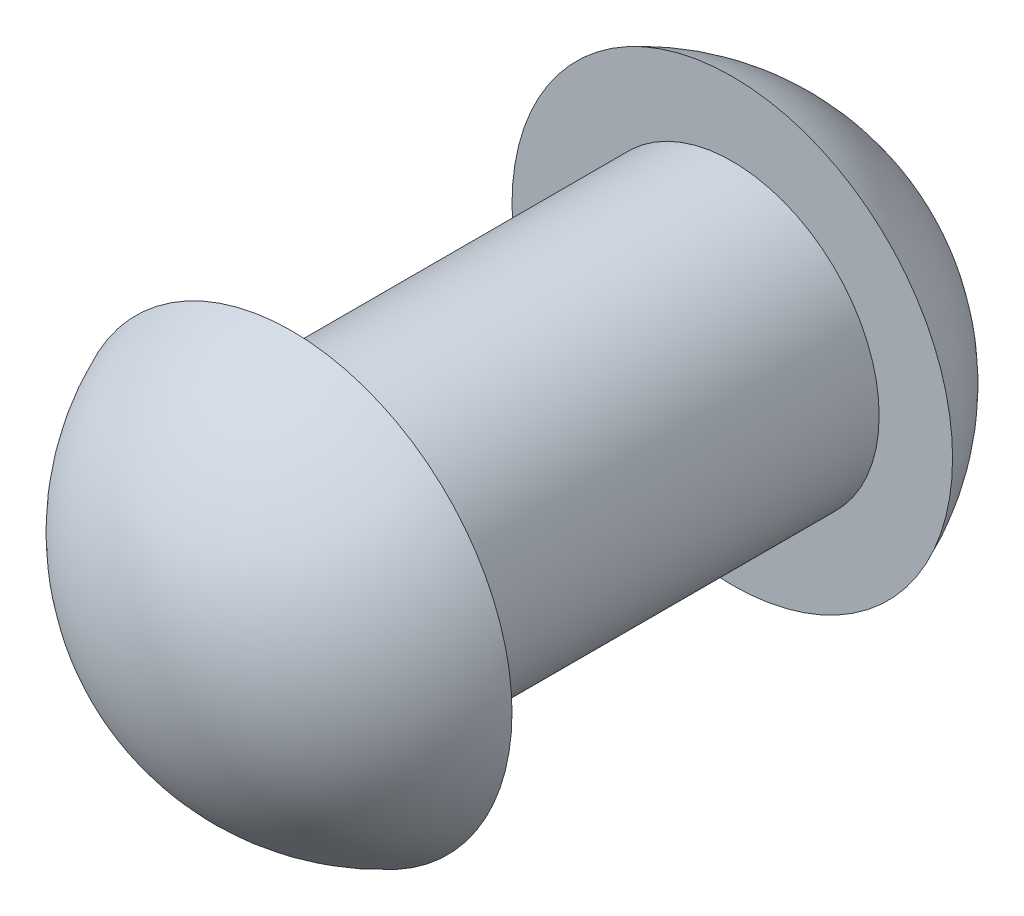
ISO-10303-21;
HEADER;
FILE_DESCRIPTION(('STEP AP214'),'2;1');
FILE_NAME('part.step','',(''),(''),'','','');
FILE_SCHEMA(('AUTOMOTIVE_DESIGN { 1 0 10303 214 1 1 1 1 }'));
ENDSEC;
DATA;
#1=APPLICATION_CONTEXT('core data for automotive mechanical design processes');
#2=APPLICATION_PROTOCOL_DEFINITION('international standard','automotive_design',2000,#1);
#3=PRODUCT_CONTEXT('',#1,'mechanical');
#4=PRODUCT('Part','Part','',(#3));
#5=PRODUCT_RELATED_PRODUCT_CATEGORY('part','',(#4));
#6=PRODUCT_DEFINITION_FORMATION('','',#4);
#7=PRODUCT_DEFINITION_CONTEXT('part definition',#1,'design');
#8=PRODUCT_DEFINITION('design','',#6,#7);
#9=PRODUCT_DEFINITION_SHAPE('','',#8);
#10=(LENGTH_UNIT() NAMED_UNIT(*) SI_UNIT(.MILLI.,.METRE.));
#11=(NAMED_UNIT(*) PLANE_ANGLE_UNIT() SI_UNIT($,.RADIAN.));
#12=(NAMED_UNIT(*) SI_UNIT($,.STERADIAN.) SOLID_ANGLE_UNIT());
#13=UNCERTAINTY_MEASURE_WITH_UNIT(LENGTH_MEASURE(1.E-05),#10,'distance_accuracy_value','');
#14=(GEOMETRIC_REPRESENTATION_CONTEXT(3) GLOBAL_UNCERTAINTY_ASSIGNED_CONTEXT((#13)) GLOBAL_UNIT_ASSIGNED_CONTEXT((#10,
#11,#12)) REPRESENTATION_CONTEXT('',''));
#15=CARTESIAN_POINT('',(0.,0.,0.));
#16=DIRECTION('',(0.,0.,1.));
#17=DIRECTION('',(1.,0.,0.));
#18=AXIS2_PLACEMENT_3D('',#15,#16,#17);
#19=CARTESIAN_POINT('',(0.,0.,-0.148076923076923));
#20=DIRECTION('',(0.,0.,-1.));
#21=DIRECTION('',(1.,0.,0.));
#22=AXIS2_PLACEMENT_3D('',#19,#20,#21);
#23=SPHERICAL_SURFACE('',#22,0.275);
#24=CARTESIAN_POINT('',(0.,0.,-0.253846153846153));
#25=DIRECTION('',(0.,0.,-1.));
#26=DIRECTION('',(-1.,0.,0.));
#27=AXIS2_PLACEMENT_3D('',#24,#25,#26);
#28=CIRCLE('',#27,0.253846153846154);
#29=CARTESIAN_POINT('',(-0.253846153846154,0.,-0.253846153846153));
#30=VERTEX_POINT('',#29);
#31=EDGE_CURVE('E10',#30,#30,#28,.T.);
#32=ORIENTED_EDGE('',*,*,#31,.T.);
#33=EDGE_LOOP('',(#32));
#34=FACE_BOUND('',#33,.T.);
#35=ADVANCED_FACE('F33',(#34),#23,.T.);
#36=CARTESIAN_POINT('',(0.253846153846154,0.,-0.253846153846153));
#37=DIRECTION('',(0.,0.,-1.));
#38=DIRECTION('',(-1.,0.,0.));
#39=AXIS2_PLACEMENT_3D('',#36,#37,#38);
#40=PLANE('',#39);
#41=ORIENTED_EDGE('',*,*,#31,.F.);
#42=EDGE_LOOP('',(#41));
#43=FACE_BOUND('',#42,.T.);
#44=CARTESIAN_POINT('',(0.,0.,-0.253846153846153));
#45=DIRECTION('',(0.,0.,-1.));
#46=DIRECTION('',(-1.,0.,0.));
#47=AXIS2_PLACEMENT_3D('',#44,#45,#46);
#48=CIRCLE('',#47,0.169230769230769);
#49=CARTESIAN_POINT('',(-0.169230769230769,0.,-0.253846153846153));
#50=VERTEX_POINT('',#49);
#51=EDGE_CURVE('E39',#50,#50,#48,.T.);
#52=ORIENTED_EDGE('',*,*,#51,.T.);
#53=EDGE_LOOP('',(#52));
#54=FACE_BOUND('',#53,.T.);
#55=ADVANCED_FACE('F65',(#43,#54),#40,.F.);
#56=CARTESIAN_POINT('',(0.,0.,-0.423076923076923));
#57=DIRECTION('',(0.,0.,-1.));
#58=DIRECTION('',(-1.,0.,0.));
#59=AXIS2_PLACEMENT_3D('',#56,#57,#58);
#60=CYLINDRICAL_SURFACE('',#59,0.169230769230769);
#61=ORIENTED_EDGE('',*,*,#51,.F.);
#62=EDGE_LOOP('',(#61));
#63=FACE_BOUND('',#62,.T.);
#64=CARTESIAN_POINT('',(0.,0.,0.253846153846153));
#65=DIRECTION('',(0.,0.,-1.));
#66=DIRECTION('',(-1.,0.,0.));
#67=AXIS2_PLACEMENT_3D('',#64,#65,#66);
#68=CIRCLE('',#67,0.169230769230769);
#69=CARTESIAN_POINT('',(-0.169230769230769,0.,0.253846153846154));
#70=VERTEX_POINT('',#69);
#71=EDGE_CURVE('E43',#70,#70,#68,.T.);
#72=ORIENTED_EDGE('',*,*,#71,.T.);
#73=EDGE_LOOP('',(#72));
#74=FACE_BOUND('',#73,.T.);
#75=ADVANCED_FACE('F61',(#63,#74),#60,.T.);
#76=CARTESIAN_POINT('',(0.169230769230769,0.,0.253846153846153));
#77=DIRECTION('',(0.,0.,1.));
#78=DIRECTION('',(1.,0.,0.));
#79=AXIS2_PLACEMENT_3D('',#76,#77,#78);
#80=PLANE('',#79);
#81=ORIENTED_EDGE('',*,*,#71,.F.);
#82=EDGE_LOOP('',(#81));
#83=FACE_BOUND('',#82,.T.);
#84=CARTESIAN_POINT('',(0.,0.,0.253846153846154));
#85=DIRECTION('',(0.,0.,-1.));
#86=DIRECTION('',(-1.,0.,0.));
#87=AXIS2_PLACEMENT_3D('',#84,#85,#86);
#88=CIRCLE('',#87,0.253846153846154);
#89=CARTESIAN_POINT('',(-0.253846153846154,0.,0.253846153846154));
#90=VERTEX_POINT('',#89);
#91=EDGE_CURVE('E47',#90,#90,#88,.T.);
#92=ORIENTED_EDGE('',*,*,#91,.T.);
#93=EDGE_LOOP('',(#92));
#94=FACE_BOUND('',#93,.T.);
#95=ADVANCED_FACE('F53',(#83,#94),#80,.F.);
#96=CARTESIAN_POINT('',(0.,0.,0.148076923076923));
#97=DIRECTION('',(0.,0.,-1.));
#98=DIRECTION('',(-1.,0.,0.));
#99=AXIS2_PLACEMENT_3D('',#96,#97,#98);
#100=SPHERICAL_SURFACE('',#99,0.275);
#101=ORIENTED_EDGE('',*,*,#91,.F.);
#102=EDGE_LOOP('',(#101));
#103=FACE_BOUND('',#102,.T.);
#104=ADVANCED_FACE('F55',(#103),#100,.T.);
#105=CLOSED_SHELL('',(#35,#55,#75,#95,#104));
#106=MANIFOLD_SOLID_BREP('B2',#105);
#107=ADVANCED_BREP_SHAPE_REPRESENTATION('',(#18,#106),#14);
#108=SHAPE_DEFINITION_REPRESENTATION(#9,#107);
ENDSEC;
END-ISO-10303-21;
